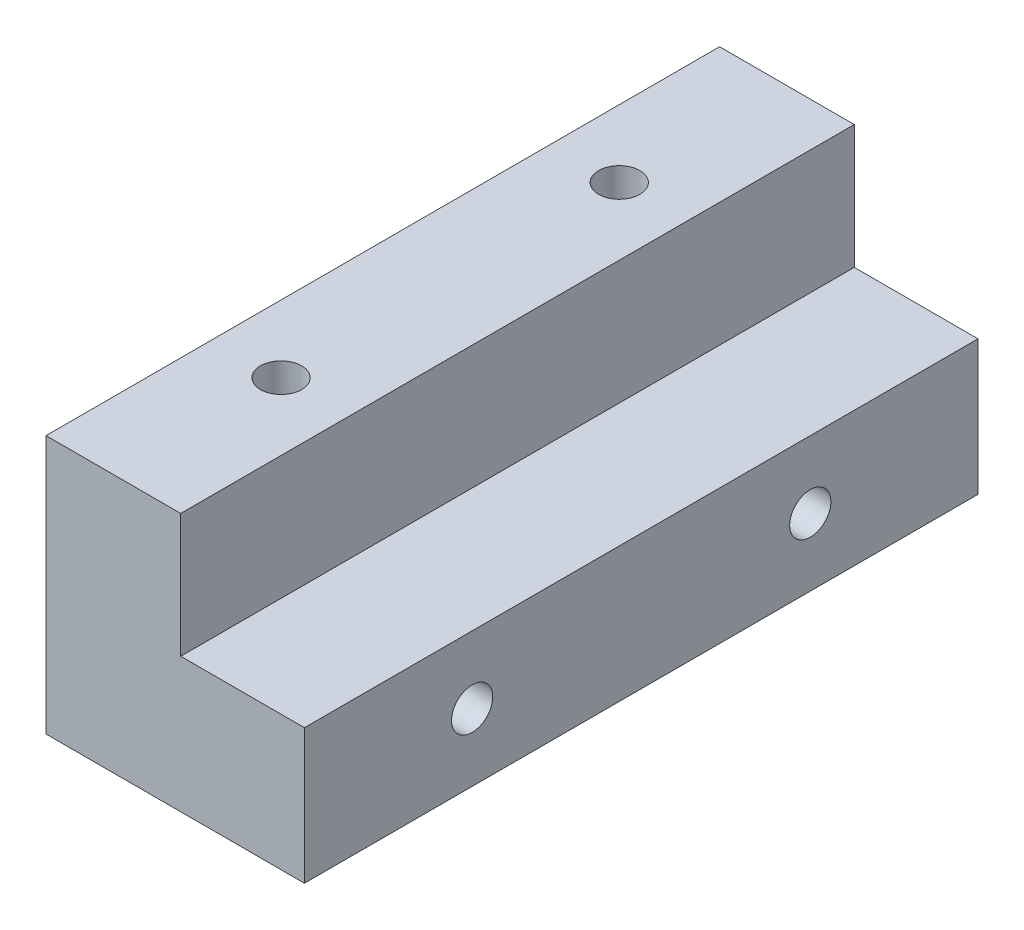
ISO-10303-21;
HEADER;
FILE_DESCRIPTION(('STEP AP214'),'2;1');
FILE_NAME('part.step','',(''),(''),'','','');
FILE_SCHEMA(('AUTOMOTIVE_DESIGN { 1 0 10303 214 1 1 1 1 }'));
ENDSEC;
DATA;
#1=APPLICATION_CONTEXT('core data for automotive mechanical design processes');
#2=APPLICATION_PROTOCOL_DEFINITION('international standard','automotive_design',2000,#1);
#3=PRODUCT_CONTEXT('',#1,'mechanical');
#4=PRODUCT('Part','Part','',(#3));
#5=PRODUCT_RELATED_PRODUCT_CATEGORY('part','',(#4));
#6=PRODUCT_DEFINITION_FORMATION('','',#4);
#7=PRODUCT_DEFINITION_CONTEXT('part definition',#1,'design');
#8=PRODUCT_DEFINITION('design','',#6,#7);
#9=PRODUCT_DEFINITION_SHAPE('','',#8);
#10=(LENGTH_UNIT() NAMED_UNIT(*) SI_UNIT(.MILLI.,.METRE.));
#11=(NAMED_UNIT(*) PLANE_ANGLE_UNIT() SI_UNIT($,.RADIAN.));
#12=(NAMED_UNIT(*) SI_UNIT($,.STERADIAN.) SOLID_ANGLE_UNIT());
#13=UNCERTAINTY_MEASURE_WITH_UNIT(LENGTH_MEASURE(1.E-05),#10,'distance_accuracy_value','');
#14=(GEOMETRIC_REPRESENTATION_CONTEXT(3) GLOBAL_UNCERTAINTY_ASSIGNED_CONTEXT((#13)) GLOBAL_UNIT_ASSIGNED_CONTEXT((#10,
#11,#12)) REPRESENTATION_CONTEXT('',''));
#15=CARTESIAN_POINT('',(0.,0.,0.));
#16=DIRECTION('',(0.,0.,1.));
#17=DIRECTION('',(1.,0.,0.));
#18=AXIS2_PLACEMENT_3D('',#15,#16,#17);
#19=CARTESIAN_POINT('',(4.9,9.4,24.5));
#20=DIRECTION('',(0.,-1.,0.));
#21=DIRECTION('',(1.,0.,0.));
#22=AXIS2_PLACEMENT_3D('',#19,#20,#21);
#23=PLANE('',#22);
#24=CARTESIAN_POINT('',(2.45,9.4,18.4));
#25=DIRECTION('',(0.,1.,0.));
#26=DIRECTION('',(-1.,0.,0.));
#27=AXIS2_PLACEMENT_3D('',#24,#25,#26);
#28=CIRCLE('',#27,0.75);
#29=CARTESIAN_POINT('',(1.7,9.4,18.4));
#30=VERTEX_POINT('',#29);
#31=EDGE_CURVE('E160',#30,#30,#28,.T.);
#32=ORIENTED_EDGE('',*,*,#31,.F.);
#33=EDGE_LOOP('',(#32));
#34=FACE_BOUND('',#33,.T.);
#35=CARTESIAN_POINT('',(2.45,9.4,6.1));
#36=DIRECTION('',(0.,1.,0.));
#37=DIRECTION('',(-1.,0.,0.));
#38=AXIS2_PLACEMENT_3D('',#35,#36,#37);
#39=CIRCLE('',#38,0.75);
#40=CARTESIAN_POINT('',(1.7,9.4,6.1));
#41=VERTEX_POINT('',#40);
#42=EDGE_CURVE('E163',#41,#41,#39,.T.);
#43=ORIENTED_EDGE('',*,*,#42,.F.);
#44=EDGE_LOOP('',(#43));
#45=FACE_BOUND('',#44,.T.);
#46=DIRECTION('',(-1.,0.,0.));
#47=VECTOR('',#46,1.);
#48=CARTESIAN_POINT('',(4.9,9.4,0.));
#49=LINE('',#48,#47);
#50=CARTESIAN_POINT('',(4.9,9.4,0.));
#51=VERTEX_POINT('',#50);
#52=CARTESIAN_POINT('',(0.,9.4,0.));
#53=VERTEX_POINT('',#52);
#54=EDGE_CURVE('E117',#51,#53,#49,.T.);
#55=ORIENTED_EDGE('',*,*,#54,.T.);
#56=DIRECTION('',(0.,0.,-1.));
#57=VECTOR('',#56,1.);
#58=CARTESIAN_POINT('',(0.,9.4,24.5));
#59=LINE('',#58,#57);
#60=CARTESIAN_POINT('',(0.,9.4,24.5));
#61=VERTEX_POINT('',#60);
#62=EDGE_CURVE('E11',#61,#53,#59,.T.);
#63=ORIENTED_EDGE('',*,*,#62,.F.);
#64=DIRECTION('',(-1.,0.,0.));
#65=VECTOR('',#64,1.);
#66=CARTESIAN_POINT('',(4.9,9.4,24.5));
#67=LINE('',#66,#65);
#68=CARTESIAN_POINT('',(4.9,9.4,24.5));
#69=VERTEX_POINT('',#68);
#70=EDGE_CURVE('E128',#69,#61,#67,.T.);
#71=ORIENTED_EDGE('',*,*,#70,.F.);
#72=DIRECTION('',(0.,0.,-1.));
#73=VECTOR('',#72,1.);
#74=CARTESIAN_POINT('',(4.9,9.4,24.5));
#75=LINE('',#74,#73);
#76=EDGE_CURVE('E113',#69,#51,#75,.T.);
#77=ORIENTED_EDGE('',*,*,#76,.T.);
#78=EDGE_LOOP('',(#55,#63,#71,#77));
#79=FACE_BOUND('',#78,.T.);
#80=ADVANCED_FACE('F33',(#34,#45,#79),#23,.F.);
#81=CARTESIAN_POINT('',(0.,9.4,24.5));
#82=DIRECTION('',(1.,0.,0.));
#83=DIRECTION('',(0.,1.,0.));
#84=AXIS2_PLACEMENT_3D('',#81,#82,#83);
#85=PLANE('',#84);
#86=DIRECTION('',(0.,-1.,0.));
#87=VECTOR('',#86,1.);
#88=CARTESIAN_POINT('',(0.,9.4,0.));
#89=LINE('',#88,#87);
#90=CARTESIAN_POINT('',(0.,0.,0.));
#91=VERTEX_POINT('',#90);
#92=EDGE_CURVE('E120',#53,#91,#89,.T.);
#93=ORIENTED_EDGE('',*,*,#92,.T.);
#94=DIRECTION('',(0.,0.,-1.));
#95=VECTOR('',#94,1.);
#96=CARTESIAN_POINT('',(0.,0.,24.5));
#97=LINE('',#96,#95);
#98=CARTESIAN_POINT('',(0.,0.,24.5));
#99=VERTEX_POINT('',#98);
#100=EDGE_CURVE('E41',#99,#91,#97,.T.);
#101=ORIENTED_EDGE('',*,*,#100,.F.);
#102=DIRECTION('',(0.,-1.,0.));
#103=VECTOR('',#102,1.);
#104=CARTESIAN_POINT('',(0.,9.4,24.5));
#105=LINE('',#104,#103);
#106=EDGE_CURVE('E86',#61,#99,#105,.T.);
#107=ORIENTED_EDGE('',*,*,#106,.F.);
#108=ORIENTED_EDGE('',*,*,#62,.T.);
#109=EDGE_LOOP('',(#93,#101,#107,#108));
#110=FACE_BOUND('',#109,.T.);
#111=ADVANCED_FACE('F152',(#110),#85,.F.);
#112=CARTESIAN_POINT('',(0.,0.,24.5));
#113=DIRECTION('',(0.,1.,0.));
#114=DIRECTION('',(-1.,0.,0.));
#115=AXIS2_PLACEMENT_3D('',#112,#113,#114);
#116=PLANE('',#115);
#117=DIRECTION('',(1.,0.,0.));
#118=VECTOR('',#117,1.);
#119=CARTESIAN_POINT('',(0.,0.,0.));
#120=LINE('',#119,#118);
#121=CARTESIAN_POINT('',(9.4,0.,0.));
#122=VERTEX_POINT('',#121);
#123=EDGE_CURVE('E123',#91,#122,#120,.T.);
#124=ORIENTED_EDGE('',*,*,#123,.T.);
#125=DIRECTION('',(0.,0.,-1.));
#126=VECTOR('',#125,1.);
#127=CARTESIAN_POINT('',(9.4,0.,24.5));
#128=LINE('',#127,#126);
#129=CARTESIAN_POINT('',(9.4,0.,24.5));
#130=VERTEX_POINT('',#129);
#131=EDGE_CURVE('E108',#130,#122,#128,.T.);
#132=ORIENTED_EDGE('',*,*,#131,.F.);
#133=DIRECTION('',(1.,0.,0.));
#134=VECTOR('',#133,1.);
#135=CARTESIAN_POINT('',(0.,0.,24.5));
#136=LINE('',#135,#134);
#137=EDGE_CURVE('E99',#99,#130,#136,.T.);
#138=ORIENTED_EDGE('',*,*,#137,.F.);
#139=ORIENTED_EDGE('',*,*,#100,.T.);
#140=EDGE_LOOP('',(#124,#132,#138,#139));
#141=FACE_BOUND('',#140,.T.);
#142=ADVANCED_FACE('F134',(#141),#116,.F.);
#143=CARTESIAN_POINT('',(9.4,0.,24.5));
#144=DIRECTION('',(-1.,0.,0.));
#145=DIRECTION('',(0.,-1.,0.));
#146=AXIS2_PLACEMENT_3D('',#143,#144,#145);
#147=PLANE('',#146);
#148=CARTESIAN_POINT('',(9.4,2.45,18.4));
#149=DIRECTION('',(1.,0.,0.));
#150=DIRECTION('',(0.,1.,0.));
#151=AXIS2_PLACEMENT_3D('',#148,#149,#150);
#152=CIRCLE('',#151,0.750000000000002);
#153=CARTESIAN_POINT('',(9.4,3.2,18.4));
#154=VERTEX_POINT('',#153);
#155=EDGE_CURVE('E169',#154,#154,#152,.T.);
#156=ORIENTED_EDGE('',*,*,#155,.F.);
#157=EDGE_LOOP('',(#156));
#158=FACE_BOUND('',#157,.T.);
#159=CARTESIAN_POINT('',(9.4,2.45,6.1));
#160=DIRECTION('',(1.,0.,0.));
#161=DIRECTION('',(0.,1.,0.));
#162=AXIS2_PLACEMENT_3D('',#159,#160,#161);
#163=CIRCLE('',#162,0.75);
#164=CARTESIAN_POINT('',(9.4,3.2,6.1));
#165=VERTEX_POINT('',#164);
#166=EDGE_CURVE('E178',#165,#165,#163,.T.);
#167=ORIENTED_EDGE('',*,*,#166,.F.);
#168=EDGE_LOOP('',(#167));
#169=FACE_BOUND('',#168,.T.);
#170=DIRECTION('',(0.,1.,0.));
#171=VECTOR('',#170,1.);
#172=CARTESIAN_POINT('',(9.4,0.,0.));
#173=LINE('',#172,#171);
#174=CARTESIAN_POINT('',(9.4,4.9,0.));
#175=VERTEX_POINT('',#174);
#176=EDGE_CURVE('E107',#122,#175,#173,.T.);
#177=ORIENTED_EDGE('',*,*,#176,.T.);
#178=DIRECTION('',(0.,0.,-1.));
#179=VECTOR('',#178,1.);
#180=CARTESIAN_POINT('',(9.4,4.9,24.5));
#181=LINE('',#180,#179);
#182=CARTESIAN_POINT('',(9.4,4.9,24.5));
#183=VERTEX_POINT('',#182);
#184=EDGE_CURVE('E104',#183,#175,#181,.T.);
#185=ORIENTED_EDGE('',*,*,#184,.F.);
#186=DIRECTION('',(0.,1.,0.));
#187=VECTOR('',#186,1.);
#188=CARTESIAN_POINT('',(9.4,0.,24.5));
#189=LINE('',#188,#187);
#190=EDGE_CURVE('E93',#130,#183,#189,.T.);
#191=ORIENTED_EDGE('',*,*,#190,.F.);
#192=ORIENTED_EDGE('',*,*,#131,.T.);
#193=EDGE_LOOP('',(#177,#185,#191,#192));
#194=FACE_BOUND('',#193,.T.);
#195=ADVANCED_FACE('F105',(#158,#169,#194),#147,.F.);
#196=CARTESIAN_POINT('',(9.4,4.9,24.5));
#197=DIRECTION('',(0.,-1.,0.));
#198=DIRECTION('',(1.,0.,0.));
#199=AXIS2_PLACEMENT_3D('',#196,#197,#198);
#200=PLANE('',#199);
#201=DIRECTION('',(-1.,0.,0.));
#202=VECTOR('',#201,1.);
#203=CARTESIAN_POINT('',(9.4,4.9,0.));
#204=LINE('',#203,#202);
#205=CARTESIAN_POINT('',(4.9,4.9,0.));
#206=VERTEX_POINT('',#205);
#207=EDGE_CURVE('E72',#175,#206,#204,.T.);
#208=ORIENTED_EDGE('',*,*,#207,.T.);
#209=DIRECTION('',(0.,0.,-1.));
#210=VECTOR('',#209,1.);
#211=CARTESIAN_POINT('',(4.9,4.9,24.5));
#212=LINE('',#211,#210);
#213=CARTESIAN_POINT('',(4.9,4.9,24.5));
#214=VERTEX_POINT('',#213);
#215=EDGE_CURVE('E109',#214,#206,#212,.T.);
#216=ORIENTED_EDGE('',*,*,#215,.F.);
#217=DIRECTION('',(-1.,0.,0.));
#218=VECTOR('',#217,1.);
#219=CARTESIAN_POINT('',(9.4,4.9,24.5));
#220=LINE('',#219,#218);
#221=EDGE_CURVE('E97',#183,#214,#220,.T.);
#222=ORIENTED_EDGE('',*,*,#221,.F.);
#223=ORIENTED_EDGE('',*,*,#184,.T.);
#224=EDGE_LOOP('',(#208,#216,#222,#223));
#225=FACE_BOUND('',#224,.T.);
#226=ADVANCED_FACE('F111',(#225),#200,.F.);
#227=CARTESIAN_POINT('',(4.9,4.9,24.5));
#228=DIRECTION('',(-1.,0.,0.));
#229=DIRECTION('',(0.,0.,1.));
#230=AXIS2_PLACEMENT_3D('',#227,#228,#229);
#231=PLANE('',#230);
#232=DIRECTION('',(0.,1.,0.));
#233=VECTOR('',#232,1.);
#234=CARTESIAN_POINT('',(4.9,4.9,0.));
#235=LINE('',#234,#233);
#236=EDGE_CURVE('E78',#206,#51,#235,.T.);
#237=ORIENTED_EDGE('',*,*,#236,.T.);
#238=ORIENTED_EDGE('',*,*,#76,.F.);
#239=DIRECTION('',(0.,1.,0.));
#240=VECTOR('',#239,1.);
#241=CARTESIAN_POINT('',(4.9,4.9,24.5));
#242=LINE('',#241,#240);
#243=EDGE_CURVE('E49',#214,#69,#242,.T.);
#244=ORIENTED_EDGE('',*,*,#243,.F.);
#245=ORIENTED_EDGE('',*,*,#215,.T.);
#246=EDGE_LOOP('',(#237,#238,#244,#245));
#247=FACE_BOUND('',#246,.T.);
#248=ADVANCED_FACE('F141',(#247),#231,.F.);
#249=CARTESIAN_POINT('',(0.,9.4,24.5));
#250=DIRECTION('',(0.,0.,1.));
#251=DIRECTION('',(1.,0.,0.));
#252=AXIS2_PLACEMENT_3D('',#249,#250,#251);
#253=PLANE('',#252);
#254=ORIENTED_EDGE('',*,*,#70,.T.);
#255=ORIENTED_EDGE('',*,*,#106,.T.);
#256=ORIENTED_EDGE('',*,*,#137,.T.);
#257=ORIENTED_EDGE('',*,*,#190,.T.);
#258=ORIENTED_EDGE('',*,*,#221,.T.);
#259=ORIENTED_EDGE('',*,*,#243,.T.);
#260=EDGE_LOOP('',(#254,#255,#256,#257,#258,#259));
#261=FACE_BOUND('',#260,.T.);
#262=ADVANCED_FACE('F95',(#261),#253,.T.);
#263=CARTESIAN_POINT('',(0.,9.4,0.));
#264=DIRECTION('',(0.,0.,1.));
#265=DIRECTION('',(1.,0.,0.));
#266=AXIS2_PLACEMENT_3D('',#263,#264,#265);
#267=PLANE('',#266);
#268=ORIENTED_EDGE('',*,*,#54,.F.);
#269=ORIENTED_EDGE('',*,*,#236,.F.);
#270=ORIENTED_EDGE('',*,*,#207,.F.);
#271=ORIENTED_EDGE('',*,*,#176,.F.);
#272=ORIENTED_EDGE('',*,*,#123,.F.);
#273=ORIENTED_EDGE('',*,*,#92,.F.);
#274=EDGE_LOOP('',(#268,#269,#270,#271,#272,#273));
#275=FACE_BOUND('',#274,.T.);
#276=ADVANCED_FACE('F137',(#275),#267,.F.);
#277=CARTESIAN_POINT('',(4.4,2.45,6.1));
#278=DIRECTION('',(1.,0.,0.));
#279=DIRECTION('',(0.,1.,0.));
#280=AXIS2_PLACEMENT_3D('',#277,#278,#279);
#281=CYLINDRICAL_SURFACE('',#280,0.75);
#282=CARTESIAN_POINT('',(4.4,2.45,6.1));
#283=DIRECTION('',(1.,0.,0.));
#284=DIRECTION('',(0.,1.,0.));
#285=AXIS2_PLACEMENT_3D('',#282,#283,#284);
#286=CIRCLE('',#285,0.75);
#287=CARTESIAN_POINT('',(4.4,3.2,6.1));
#288=VERTEX_POINT('',#287);
#289=EDGE_CURVE('E121',#288,#288,#286,.T.);
#290=ORIENTED_EDGE('',*,*,#289,.F.);
#291=EDGE_LOOP('',(#290));
#292=FACE_BOUND('',#291,.T.);
#293=ORIENTED_EDGE('',*,*,#166,.T.);
#294=EDGE_LOOP('',(#293));
#295=FACE_BOUND('',#294,.T.);
#296=ADVANCED_FACE('F188',(#292,#295),#281,.F.);
#297=CARTESIAN_POINT('',(4.4,2.45,6.1));
#298=DIRECTION('',(1.,0.,0.));
#299=DIRECTION('',(0.,1.,0.));
#300=AXIS2_PLACEMENT_3D('',#297,#298,#299);
#301=PLANE('',#300);
#302=ORIENTED_EDGE('',*,*,#289,.T.);
#303=EDGE_LOOP('',(#302));
#304=FACE_BOUND('',#303,.T.);
#305=ADVANCED_FACE('F202',(#304),#301,.T.);
#306=CARTESIAN_POINT('',(4.4,2.45,18.4));
#307=DIRECTION('',(1.,0.,0.));
#308=DIRECTION('',(0.,1.,0.));
#309=AXIS2_PLACEMENT_3D('',#306,#307,#308);
#310=CYLINDRICAL_SURFACE('',#309,0.750000000000002);
#311=CARTESIAN_POINT('',(4.4,2.45,18.4));
#312=DIRECTION('',(1.,0.,0.));
#313=DIRECTION('',(0.,1.,0.));
#314=AXIS2_PLACEMENT_3D('',#311,#312,#313);
#315=CIRCLE('',#314,0.750000000000002);
#316=CARTESIAN_POINT('',(4.4,3.2,18.4));
#317=VERTEX_POINT('',#316);
#318=EDGE_CURVE('E175',#317,#317,#315,.T.);
#319=ORIENTED_EDGE('',*,*,#318,.F.);
#320=EDGE_LOOP('',(#319));
#321=FACE_BOUND('',#320,.T.);
#322=ORIENTED_EDGE('',*,*,#155,.T.);
#323=EDGE_LOOP('',(#322));
#324=FACE_BOUND('',#323,.T.);
#325=ADVANCED_FACE('F199',(#321,#324),#310,.F.);
#326=CARTESIAN_POINT('',(4.4,2.45,18.4));
#327=DIRECTION('',(1.,0.,0.));
#328=DIRECTION('',(0.,1.,0.));
#329=AXIS2_PLACEMENT_3D('',#326,#327,#328);
#330=PLANE('',#329);
#331=ORIENTED_EDGE('',*,*,#318,.T.);
#332=EDGE_LOOP('',(#331));
#333=FACE_BOUND('',#332,.T.);
#334=ADVANCED_FACE('F201',(#333),#330,.T.);
#335=CARTESIAN_POINT('',(2.45,4.4,6.1));
#336=DIRECTION('',(0.,1.,0.));
#337=DIRECTION('',(-1.,0.,0.));
#338=AXIS2_PLACEMENT_3D('',#335,#336,#337);
#339=CYLINDRICAL_SURFACE('',#338,0.75);
#340=CARTESIAN_POINT('',(2.45,4.4,6.1));
#341=DIRECTION('',(0.,1.,0.));
#342=DIRECTION('',(-1.,0.,0.));
#343=AXIS2_PLACEMENT_3D('',#340,#341,#342);
#344=CIRCLE('',#343,0.75);
#345=CARTESIAN_POINT('',(1.7,4.4,6.1));
#346=VERTEX_POINT('',#345);
#347=EDGE_CURVE('E165',#346,#346,#344,.T.);
#348=ORIENTED_EDGE('',*,*,#347,.F.);
#349=EDGE_LOOP('',(#348));
#350=FACE_BOUND('',#349,.T.);
#351=ORIENTED_EDGE('',*,*,#42,.T.);
#352=EDGE_LOOP('',(#351));
#353=FACE_BOUND('',#352,.T.);
#354=ADVANCED_FACE('F209',(#350,#353),#339,.F.);
#355=CARTESIAN_POINT('',(2.45,4.4,6.1));
#356=DIRECTION('',(0.,1.,0.));
#357=DIRECTION('',(-1.,0.,0.));
#358=AXIS2_PLACEMENT_3D('',#355,#356,#357);
#359=PLANE('',#358);
#360=ORIENTED_EDGE('',*,*,#347,.T.);
#361=EDGE_LOOP('',(#360));
#362=FACE_BOUND('',#361,.T.);
#363=ADVANCED_FACE('F256',(#362),#359,.T.);
#364=CARTESIAN_POINT('',(2.45,4.4,18.4));
#365=DIRECTION('',(0.,1.,0.));
#366=DIRECTION('',(-1.,0.,0.));
#367=AXIS2_PLACEMENT_3D('',#364,#365,#366);
#368=CYLINDRICAL_SURFACE('',#367,0.75);
#369=CARTESIAN_POINT('',(2.45,4.4,18.4));
#370=DIRECTION('',(0.,1.,0.));
#371=DIRECTION('',(-1.,0.,0.));
#372=AXIS2_PLACEMENT_3D('',#369,#370,#371);
#373=CIRCLE('',#372,0.75);
#374=CARTESIAN_POINT('',(1.7,4.4,18.4));
#375=VERTEX_POINT('',#374);
#376=EDGE_CURVE('E166',#375,#375,#373,.T.);
#377=ORIENTED_EDGE('',*,*,#376,.F.);
#378=EDGE_LOOP('',(#377));
#379=FACE_BOUND('',#378,.T.);
#380=ORIENTED_EDGE('',*,*,#31,.T.);
#381=EDGE_LOOP('',(#380));
#382=FACE_BOUND('',#381,.T.);
#383=ADVANCED_FACE('F265',(#379,#382),#368,.F.);
#384=CARTESIAN_POINT('',(2.45,4.4,18.4));
#385=DIRECTION('',(0.,1.,0.));
#386=DIRECTION('',(-1.,0.,0.));
#387=AXIS2_PLACEMENT_3D('',#384,#385,#386);
#388=PLANE('',#387);
#389=ORIENTED_EDGE('',*,*,#376,.T.);
#390=EDGE_LOOP('',(#389));
#391=FACE_BOUND('',#390,.T.);
#392=ADVANCED_FACE('F275',(#391),#388,.T.);
#393=CLOSED_SHELL('',(#80,#111,#142,#195,#226,#248,#262,#276,#296,#305,#325,#334,#354,#363,#383,#392));
#394=MANIFOLD_SOLID_BREP('B2',#393);
#395=ADVANCED_BREP_SHAPE_REPRESENTATION('',(#18,#394),#14);
#396=SHAPE_DEFINITION_REPRESENTATION(#9,#395);
ENDSEC;
END-ISO-10303-21;
